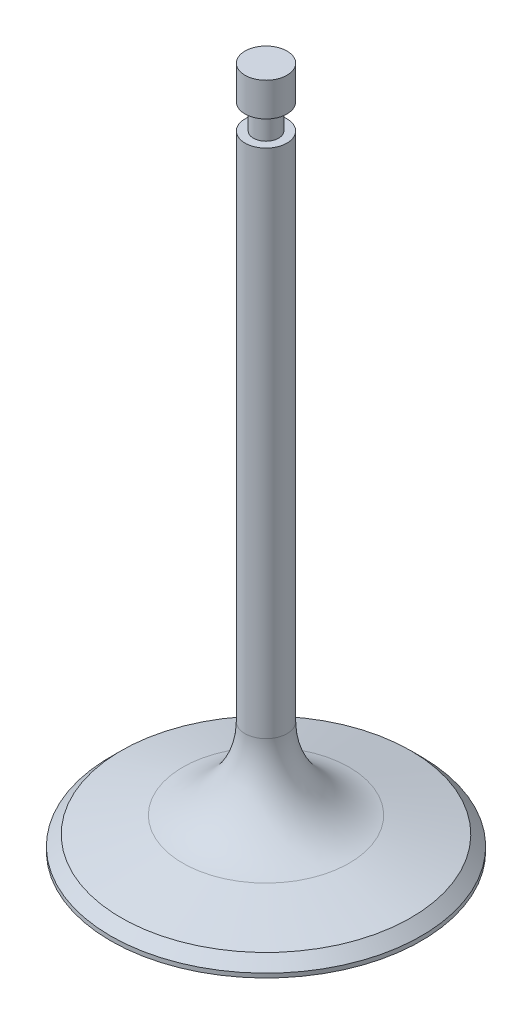
ISO-10303-21;
HEADER;
FILE_DESCRIPTION(('STEP AP214'),'2;1');
FILE_NAME('part.step','',(''),(''),'','','');
FILE_SCHEMA(('AUTOMOTIVE_DESIGN { 1 0 10303 214 1 1 1 1 }'));
ENDSEC;
DATA;
#1=APPLICATION_CONTEXT('core data for automotive mechanical design processes');
#2=APPLICATION_PROTOCOL_DEFINITION('international standard','automotive_design',2000,#1);
#3=PRODUCT_CONTEXT('',#1,'mechanical');
#4=PRODUCT('Part','Part','',(#3));
#5=PRODUCT_RELATED_PRODUCT_CATEGORY('part','',(#4));
#6=PRODUCT_DEFINITION_FORMATION('','',#4);
#7=PRODUCT_DEFINITION_CONTEXT('part definition',#1,'design');
#8=PRODUCT_DEFINITION('design','',#6,#7);
#9=PRODUCT_DEFINITION_SHAPE('','',#8);
#10=(LENGTH_UNIT() NAMED_UNIT(*) SI_UNIT(.MILLI.,.METRE.));
#11=(NAMED_UNIT(*) PLANE_ANGLE_UNIT() SI_UNIT($,.RADIAN.));
#12=(NAMED_UNIT(*) SI_UNIT($,.STERADIAN.) SOLID_ANGLE_UNIT());
#13=UNCERTAINTY_MEASURE_WITH_UNIT(LENGTH_MEASURE(1.E-05),#10,'distance_accuracy_value','');
#14=(GEOMETRIC_REPRESENTATION_CONTEXT(3) GLOBAL_UNCERTAINTY_ASSIGNED_CONTEXT((#13)) GLOBAL_UNIT_ASSIGNED_CONTEXT((#10,
#11,#12)) REPRESENTATION_CONTEXT('',''));
#15=CARTESIAN_POINT('',(0.,0.,0.));
#16=DIRECTION('',(0.,0.,1.));
#17=DIRECTION('',(1.,0.,0.));
#18=AXIS2_PLACEMENT_3D('',#15,#16,#17);
#19=CARTESIAN_POINT('',(0.,114.833333333333,0.));
#20=DIRECTION('',(0.,-1.,0.));
#21=DIRECTION('',(0.,0.,-1.));
#22=AXIS2_PLACEMENT_3D('',#19,#20,#21);
#23=SPHERICAL_SURFACE('',#22,114.833333333333);
#24=CARTESIAN_POINT('',(0.,1.5,0.));
#25=DIRECTION('',(0.,-1.,0.));
#26=DIRECTION('',(0.,0.,-1.));
#27=AXIS2_PLACEMENT_3D('',#24,#25,#26);
#28=CIRCLE('',#27,18.5);
#29=CARTESIAN_POINT('',(0.,1.5,-18.5));
#30=VERTEX_POINT('',#29);
#31=EDGE_CURVE('E10',#30,#30,#28,.T.);
#32=ORIENTED_EDGE('',*,*,#31,.T.);
#33=EDGE_LOOP('',(#32));
#34=FACE_BOUND('',#33,.T.);
#35=ADVANCED_FACE('F37',(#34),#23,.T.);
#36=CARTESIAN_POINT('',(0.,0.,0.));
#37=DIRECTION('',(0.,-1.,0.));
#38=DIRECTION('',(0.,0.,-1.));
#39=AXIS2_PLACEMENT_3D('',#36,#37,#38);
#40=CYLINDRICAL_SURFACE('',#39,18.5);
#41=CARTESIAN_POINT('',(0.,2.,0.));
#42=DIRECTION('',(0.,-1.,0.));
#43=DIRECTION('',(0.,0.,-1.));
#44=AXIS2_PLACEMENT_3D('',#41,#42,#43);
#45=CIRCLE('',#44,18.5);
#46=CARTESIAN_POINT('',(0.,2.,-18.5));
#47=VERTEX_POINT('',#46);
#48=EDGE_CURVE('E44',#47,#47,#45,.T.);
#49=ORIENTED_EDGE('',*,*,#48,.T.);
#50=EDGE_LOOP('',(#49));
#51=FACE_BOUND('',#50,.T.);
#52=ORIENTED_EDGE('',*,*,#31,.F.);
#53=EDGE_LOOP('',(#52));
#54=FACE_BOUND('',#53,.T.);
#55=ADVANCED_FACE('F97',(#51,#54),#40,.T.);
#56=CARTESIAN_POINT('',(0.,2.,0.));
#57=DIRECTION('',(0.,-1.,0.));
#58=DIRECTION('',(0.,0.,-1.));
#59=AXIS2_PLACEMENT_3D('',#56,#57,#58);
#60=CONICAL_SURFACE('',#59,18.5,0.785398163397431);
#61=CARTESIAN_POINT('',(0.,3.25,0.));
#62=DIRECTION('',(0.,-1.,0.));
#63=DIRECTION('',(0.,0.,-1.));
#64=AXIS2_PLACEMENT_3D('',#61,#62,#63);
#65=CIRCLE('',#64,17.25);
#66=CARTESIAN_POINT('',(0.,3.25,-17.25));
#67=VERTEX_POINT('',#66);
#68=EDGE_CURVE('E49',#67,#67,#65,.T.);
#69=ORIENTED_EDGE('',*,*,#68,.T.);
#70=EDGE_LOOP('',(#69));
#71=FACE_BOUND('',#70,.T.);
#72=ORIENTED_EDGE('',*,*,#48,.F.);
#73=EDGE_LOOP('',(#72));
#74=FACE_BOUND('',#73,.T.);
#75=ADVANCED_FACE('F101',(#71,#74),#60,.T.);
#76=CARTESIAN_POINT('',(0.,3.25,0.));
#77=DIRECTION('',(0.,-1.,0.));
#78=DIRECTION('',(0.,0.,-1.));
#79=AXIS2_PLACEMENT_3D('',#76,#77,#78);
#80=CONICAL_SURFACE('',#79,17.25,1.30899693899576);
#81=CARTESIAN_POINT('',(0.,5.21626220525787,0.));
#82=DIRECTION('',(0.,-1.,0.));
#83=DIRECTION('',(0.,0.,-1.));
#84=AXIS2_PLACEMENT_3D('',#81,#82,#83);
#85=CIRCLE('',#84,9.91180954897502);
#86=CARTESIAN_POINT('',(0.,5.21626220525787,-9.91180954897502));
#87=VERTEX_POINT('',#86);
#88=EDGE_CURVE('E54',#87,#87,#85,.T.);
#89=ORIENTED_EDGE('',*,*,#88,.T.);
#90=EDGE_LOOP('',(#89));
#91=FACE_BOUND('',#90,.T.);
#92=ORIENTED_EDGE('',*,*,#68,.F.);
#93=EDGE_LOOP('',(#92));
#94=FACE_BOUND('',#93,.T.);
#95=ADVANCED_FACE('F105',(#91,#94),#80,.T.);
#96=CARTESIAN_POINT('',(0.,14.8755204681486,0.));
#97=DIRECTION('',(0.,-1.,0.));
#98=DIRECTION('',(0.,0.,-1.));
#99=AXIS2_PLACEMENT_3D('',#96,#97,#98);
#100=TOROIDAL_SURFACE('',#99,12.5000000000001,10.);
#101=CARTESIAN_POINT('',(0.,14.8755204681486,0.));
#102=DIRECTION('',(0.,-1.,0.));
#103=DIRECTION('',(0.,0.,-1.));
#104=AXIS2_PLACEMENT_3D('',#101,#102,#103);
#105=CIRCLE('',#104,2.50000000000014);
#106=CARTESIAN_POINT('',(0.,14.8755204681486,-2.50000000000014));
#107=VERTEX_POINT('',#106);
#108=EDGE_CURVE('E60',#107,#107,#105,.T.);
#109=ORIENTED_EDGE('',*,*,#108,.T.);
#110=EDGE_LOOP('',(#109));
#111=FACE_BOUND('',#110,.T.);
#112=ORIENTED_EDGE('',*,*,#88,.F.);
#113=EDGE_LOOP('',(#112));
#114=FACE_BOUND('',#113,.T.);
#115=ADVANCED_FACE('F112',(#111,#114),#100,.F.);
#116=CARTESIAN_POINT('',(0.,0.,0.));
#117=DIRECTION('',(0.,-1.,0.));
#118=DIRECTION('',(0.,0.,-1.));
#119=AXIS2_PLACEMENT_3D('',#116,#117,#118);
#120=CYLINDRICAL_SURFACE('',#119,2.50000000000007);
#121=CARTESIAN_POINT('',(0.,75.79,0.));
#122=DIRECTION('',(0.,-1.,0.));
#123=DIRECTION('',(0.,0.,-1.));
#124=AXIS2_PLACEMENT_3D('',#121,#122,#123);
#125=CIRCLE('',#124,2.5);
#126=CARTESIAN_POINT('',(0.,75.79,-2.5));
#127=VERTEX_POINT('',#126);
#128=EDGE_CURVE('E64',#127,#127,#125,.T.);
#129=ORIENTED_EDGE('',*,*,#128,.T.);
#130=EDGE_LOOP('',(#129));
#131=FACE_BOUND('',#130,.T.);
#132=ORIENTED_EDGE('',*,*,#108,.F.);
#133=EDGE_LOOP('',(#132));
#134=FACE_BOUND('',#133,.T.);
#135=ADVANCED_FACE('F116',(#131,#134),#120,.T.);
#136=CARTESIAN_POINT('',(0.,75.79,-1.5));
#137=DIRECTION('',(0.,1.,0.));
#138=DIRECTION('',(0.,0.,1.));
#139=AXIS2_PLACEMENT_3D('',#136,#137,#138);
#140=PLANE('',#139);
#141=CARTESIAN_POINT('',(0.,75.79,0.));
#142=DIRECTION('',(0.,-1.,0.));
#143=DIRECTION('',(0.,0.,-1.));
#144=AXIS2_PLACEMENT_3D('',#141,#142,#143);
#145=CIRCLE('',#144,1.5);
#146=CARTESIAN_POINT('',(0.,75.79,-1.5));
#147=VERTEX_POINT('',#146);
#148=EDGE_CURVE('E68',#147,#147,#145,.T.);
#149=ORIENTED_EDGE('',*,*,#148,.T.);
#150=EDGE_LOOP('',(#149));
#151=FACE_BOUND('',#150,.T.);
#152=ORIENTED_EDGE('',*,*,#128,.F.);
#153=EDGE_LOOP('',(#152));
#154=FACE_BOUND('',#153,.T.);
#155=ADVANCED_FACE('F120',(#151,#154),#140,.T.);
#156=CARTESIAN_POINT('',(0.,0.,0.));
#157=DIRECTION('',(0.,-1.,0.));
#158=DIRECTION('',(0.,0.,-1.));
#159=AXIS2_PLACEMENT_3D('',#156,#157,#158);
#160=CYLINDRICAL_SURFACE('',#159,1.5);
#161=CARTESIAN_POINT('',(0.,78.79,0.));
#162=DIRECTION('',(0.,-1.,0.));
#163=DIRECTION('',(0.,0.,-1.));
#164=AXIS2_PLACEMENT_3D('',#161,#162,#163);
#165=CIRCLE('',#164,1.5);
#166=CARTESIAN_POINT('',(0.,78.79,-1.5));
#167=VERTEX_POINT('',#166);
#168=EDGE_CURVE('E72',#167,#167,#165,.T.);
#169=ORIENTED_EDGE('',*,*,#168,.T.);
#170=EDGE_LOOP('',(#169));
#171=FACE_BOUND('',#170,.T.);
#172=ORIENTED_EDGE('',*,*,#148,.F.);
#173=EDGE_LOOP('',(#172));
#174=FACE_BOUND('',#173,.T.);
#175=ADVANCED_FACE('F124',(#171,#174),#160,.T.);
#176=CARTESIAN_POINT('',(0.,78.79,-2.5));
#177=DIRECTION('',(0.,-1.,0.));
#178=DIRECTION('',(0.,0.,-1.));
#179=AXIS2_PLACEMENT_3D('',#176,#177,#178);
#180=PLANE('',#179);
#181=CARTESIAN_POINT('',(0.,78.79,0.));
#182=DIRECTION('',(0.,-1.,0.));
#183=DIRECTION('',(0.,0.,-1.));
#184=AXIS2_PLACEMENT_3D('',#181,#182,#183);
#185=CIRCLE('',#184,2.5);
#186=CARTESIAN_POINT('',(0.,78.79,-2.5));
#187=VERTEX_POINT('',#186);
#188=EDGE_CURVE('E76',#187,#187,#185,.T.);
#189=ORIENTED_EDGE('',*,*,#188,.T.);
#190=EDGE_LOOP('',(#189));
#191=FACE_BOUND('',#190,.T.);
#192=ORIENTED_EDGE('',*,*,#168,.F.);
#193=EDGE_LOOP('',(#192));
#194=FACE_BOUND('',#193,.T.);
#195=ADVANCED_FACE('F94',(#191,#194),#180,.T.);
#196=CARTESIAN_POINT('',(0.,0.,0.));
#197=DIRECTION('',(0.,-1.,0.));
#198=DIRECTION('',(0.,0.,-1.));
#199=AXIS2_PLACEMENT_3D('',#196,#197,#198);
#200=CYLINDRICAL_SURFACE('',#199,2.5);
#201=CARTESIAN_POINT('',(0.,82.79,0.));
#202=DIRECTION('',(0.,-1.,0.));
#203=DIRECTION('',(0.,0.,-1.));
#204=AXIS2_PLACEMENT_3D('',#201,#202,#203);
#205=CIRCLE('',#204,2.49999999999999);
#206=CARTESIAN_POINT('',(0.,82.79,-2.49999999999999));
#207=VERTEX_POINT('',#206);
#208=EDGE_CURVE('E80',#207,#207,#205,.T.);
#209=ORIENTED_EDGE('',*,*,#208,.T.);
#210=EDGE_LOOP('',(#209));
#211=FACE_BOUND('',#210,.T.);
#212=ORIENTED_EDGE('',*,*,#188,.F.);
#213=EDGE_LOOP('',(#212));
#214=FACE_BOUND('',#213,.T.);
#215=ADVANCED_FACE('F85',(#211,#214),#200,.T.);
#216=CARTESIAN_POINT('',(0.,82.79,0.));
#217=DIRECTION('',(0.,1.,0.));
#218=DIRECTION('',(0.,0.,1.));
#219=AXIS2_PLACEMENT_3D('',#216,#217,#218);
#220=PLANE('',#219);
#221=ORIENTED_EDGE('',*,*,#208,.F.);
#222=EDGE_LOOP('',(#221));
#223=FACE_BOUND('',#222,.T.);
#224=ADVANCED_FACE('F88',(#223),#220,.T.);
#225=CLOSED_SHELL('',(#35,#55,#75,#95,#115,#135,#155,#175,#195,#215,#224));
#226=MANIFOLD_SOLID_BREP('B2',#225);
#227=ADVANCED_BREP_SHAPE_REPRESENTATION('',(#18,#226),#14);
#228=SHAPE_DEFINITION_REPRESENTATION(#9,#227);
ENDSEC;
END-ISO-10303-21;
